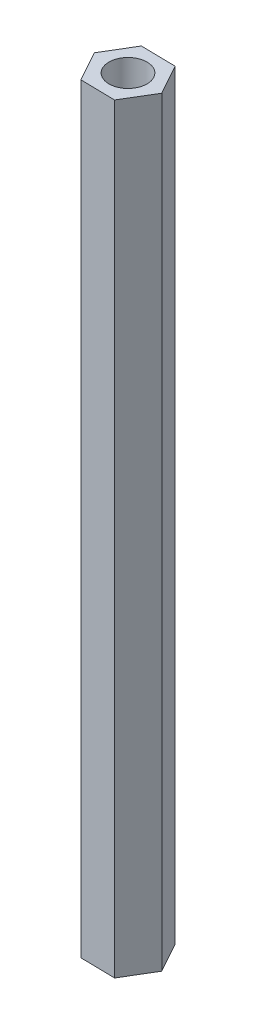
ISO-10303-21;
HEADER;
FILE_DESCRIPTION(('STEP AP214'),'2;1');
FILE_NAME('part.step','',(''),(''),'','','');
FILE_SCHEMA(('AUTOMOTIVE_DESIGN { 1 0 10303 214 1 1 1 1 }'));
ENDSEC;
DATA;
#1=APPLICATION_CONTEXT('core data for automotive mechanical design processes');
#2=APPLICATION_PROTOCOL_DEFINITION('international standard','automotive_design',2000,#1);
#3=PRODUCT_CONTEXT('',#1,'mechanical');
#4=PRODUCT('Part','Part','',(#3));
#5=PRODUCT_RELATED_PRODUCT_CATEGORY('part','',(#4));
#6=PRODUCT_DEFINITION_FORMATION('','',#4);
#7=PRODUCT_DEFINITION_CONTEXT('part definition',#1,'design');
#8=PRODUCT_DEFINITION('design','',#6,#7);
#9=PRODUCT_DEFINITION_SHAPE('','',#8);
#10=(LENGTH_UNIT() NAMED_UNIT(*) SI_UNIT(.MILLI.,.METRE.));
#11=(NAMED_UNIT(*) PLANE_ANGLE_UNIT() SI_UNIT($,.RADIAN.));
#12=(NAMED_UNIT(*) SI_UNIT($,.STERADIAN.) SOLID_ANGLE_UNIT());
#13=UNCERTAINTY_MEASURE_WITH_UNIT(LENGTH_MEASURE(1.E-05),#10,'distance_accuracy_value','');
#14=(GEOMETRIC_REPRESENTATION_CONTEXT(3) GLOBAL_UNCERTAINTY_ASSIGNED_CONTEXT((#13)) GLOBAL_UNIT_ASSIGNED_CONTEXT((#10,
#11,#12)) REPRESENTATION_CONTEXT('',''));
#15=CARTESIAN_POINT('',(0.,0.,0.));
#16=DIRECTION('',(0.,0.,1.));
#17=DIRECTION('',(1.,0.,0.));
#18=AXIS2_PLACEMENT_3D('',#15,#16,#17);
#19=CARTESIAN_POINT('',(0.,60.,0.));
#20=DIRECTION('',(0.,1.,0.));
#21=DIRECTION('',(0.,0.,1.));
#22=AXIS2_PLACEMENT_3D('',#19,#20,#21);
#23=PLANE('',#22);
#24=DIRECTION('',(-0.999831561867129,0.,-0.018353416421371));
#25=VECTOR('',#24,1.);
#26=CARTESIAN_POINT('',(1.39967512885266,60.,-2.3247027480959));
#27=LINE('',#26,#25);
#28=CARTESIAN_POINT('',(1.39967512885266,60.,-2.3247027480959));
#29=VERTEX_POINT('',#28);
#30=CARTESIAN_POINT('',(-1.31341407167221,60.,-2.37450559267961));
#31=VERTEX_POINT('',#30);
#32=EDGE_CURVE('E146',#29,#31,#27,.T.);
#33=ORIENTED_EDGE('',*,*,#32,.T.);
#34=DIRECTION('',(-0.515810305800707,0.,0.856702823871721));
#35=VECTOR('',#34,1.);
#36=CARTESIAN_POINT('',(-1.31341407167221,60.,-2.37450559267961));
#37=LINE('',#36,#35);
#38=CARTESIAN_POINT('',(-2.71308920052487,60.,-0.0498028445837118));
#39=VERTEX_POINT('',#38);
#40=EDGE_CURVE('E94',#31,#39,#37,.T.);
#41=ORIENTED_EDGE('',*,*,#40,.T.);
#42=DIRECTION('',(0.484021256066423,0.,0.875056240293093));
#43=VECTOR('',#42,1.);
#44=CARTESIAN_POINT('',(-2.71308920052487,60.,-0.0498028445837118));
#45=LINE('',#44,#43);
#46=CARTESIAN_POINT('',(-1.39967512885266,60.,2.3247027480959));
#47=VERTEX_POINT('',#46);
#48=EDGE_CURVE('E107',#39,#47,#45,.T.);
#49=ORIENTED_EDGE('',*,*,#48,.T.);
#50=DIRECTION('',(0.99983156186713,0.,0.0183534164213715));
#51=VECTOR('',#50,1.);
#52=CARTESIAN_POINT('',(-1.39967512885266,60.,2.3247027480959));
#53=LINE('',#52,#51);
#54=CARTESIAN_POINT('',(1.31341407167222,60.,2.37450559267961));
#55=VERTEX_POINT('',#54);
#56=EDGE_CURVE('E101',#47,#55,#53,.T.);
#57=ORIENTED_EDGE('',*,*,#56,.T.);
#58=DIRECTION('',(0.515810305800707,0.,-0.856702823871721));
#59=VECTOR('',#58,1.);
#60=CARTESIAN_POINT('',(1.31341407167222,60.,2.37450559267961));
#61=LINE('',#60,#59);
#62=CARTESIAN_POINT('',(2.71308920052488,60.,0.0498028445837108));
#63=VERTEX_POINT('',#62);
#64=EDGE_CURVE('E105',#55,#63,#61,.T.);
#65=ORIENTED_EDGE('',*,*,#64,.T.);
#66=DIRECTION('',(-0.484021256066423,0.,-0.875056240293092));
#67=VECTOR('',#66,1.);
#68=CARTESIAN_POINT('',(2.71308920052488,60.,0.0498028445837108));
#69=LINE('',#68,#67);
#70=EDGE_CURVE('E57',#63,#29,#69,.T.);
#71=ORIENTED_EDGE('',*,*,#70,.T.);
#72=EDGE_LOOP('',(#33,#41,#49,#57,#65,#71));
#73=FACE_BOUND('',#72,.T.);
#74=CARTESIAN_POINT('',(0.,60.,0.));
#75=DIRECTION('',(0.,1.,0.));
#76=DIRECTION('',(0.,0.,1.));
#77=AXIS2_PLACEMENT_3D('',#74,#75,#76);
#78=CIRCLE('',#77,1.5);
#79=CARTESIAN_POINT('',(0.,60.,1.5));
#80=VERTEX_POINT('',#79);
#81=EDGE_CURVE('E134',#80,#80,#78,.T.);
#82=ORIENTED_EDGE('',*,*,#81,.F.);
#83=EDGE_LOOP('',(#82));
#84=FACE_BOUND('',#83,.T.);
#85=ADVANCED_FACE('F39',(#73,#84),#23,.T.);
#86=CARTESIAN_POINT('',(0.,0.,0.));
#87=DIRECTION('',(0.,1.,0.));
#88=DIRECTION('',(0.,0.,1.));
#89=AXIS2_PLACEMENT_3D('',#86,#87,#88);
#90=PLANE('',#89);
#91=DIRECTION('',(-0.999831561867129,0.,-0.018353416421371));
#92=VECTOR('',#91,1.);
#93=CARTESIAN_POINT('',(1.39967512885266,0.,-2.3247027480959));
#94=LINE('',#93,#92);
#95=CARTESIAN_POINT('',(1.39967512885266,0.,-2.3247027480959));
#96=VERTEX_POINT('',#95);
#97=CARTESIAN_POINT('',(-1.31341407167221,0.,-2.37450559267961));
#98=VERTEX_POINT('',#97);
#99=EDGE_CURVE('E129',#96,#98,#94,.T.);
#100=ORIENTED_EDGE('',*,*,#99,.F.);
#101=DIRECTION('',(-0.484021256066423,0.,-0.875056240293092));
#102=VECTOR('',#101,1.);
#103=CARTESIAN_POINT('',(2.71308920052488,0.,0.0498028445837108));
#104=LINE('',#103,#102);
#105=CARTESIAN_POINT('',(2.71308920052488,0.,0.0498028445837108));
#106=VERTEX_POINT('',#105);
#107=EDGE_CURVE('E86',#106,#96,#104,.T.);
#108=ORIENTED_EDGE('',*,*,#107,.F.);
#109=DIRECTION('',(0.515810305800707,0.,-0.856702823871721));
#110=VECTOR('',#109,1.);
#111=CARTESIAN_POINT('',(1.31341407167222,0.,2.37450559267961));
#112=LINE('',#111,#110);
#113=CARTESIAN_POINT('',(1.31341407167222,0.,2.37450559267961));
#114=VERTEX_POINT('',#113);
#115=EDGE_CURVE('E80',#114,#106,#112,.T.);
#116=ORIENTED_EDGE('',*,*,#115,.F.);
#117=DIRECTION('',(0.99983156186713,0.,0.0183534164213715));
#118=VECTOR('',#117,1.);
#119=CARTESIAN_POINT('',(-1.39967512885266,0.,2.3247027480959));
#120=LINE('',#119,#118);
#121=CARTESIAN_POINT('',(-1.39967512885266,0.,2.3247027480959));
#122=VERTEX_POINT('',#121);
#123=EDGE_CURVE('E116',#122,#114,#120,.T.);
#124=ORIENTED_EDGE('',*,*,#123,.F.);
#125=DIRECTION('',(0.484021256066423,0.,0.875056240293093));
#126=VECTOR('',#125,1.);
#127=CARTESIAN_POINT('',(-2.71308920052487,0.,-0.0498028445837118));
#128=LINE('',#127,#126);
#129=CARTESIAN_POINT('',(-2.71308920052487,0.,-0.0498028445837118));
#130=VERTEX_POINT('',#129);
#131=EDGE_CURVE('E137',#130,#122,#128,.T.);
#132=ORIENTED_EDGE('',*,*,#131,.F.);
#133=DIRECTION('',(-0.515810305800707,0.,0.856702823871721));
#134=VECTOR('',#133,1.);
#135=CARTESIAN_POINT('',(-1.31341407167221,0.,-2.37450559267961));
#136=LINE('',#135,#134);
#137=EDGE_CURVE('E133',#98,#130,#136,.T.);
#138=ORIENTED_EDGE('',*,*,#137,.F.);
#139=EDGE_LOOP('',(#100,#108,#116,#124,#132,#138));
#140=FACE_BOUND('',#139,.T.);
#141=CARTESIAN_POINT('',(0.,0.,0.));
#142=DIRECTION('',(0.,1.,0.));
#143=DIRECTION('',(0.,0.,1.));
#144=AXIS2_PLACEMENT_3D('',#141,#142,#143);
#145=CIRCLE('',#144,1.5);
#146=CARTESIAN_POINT('',(0.,0.,1.5));
#147=VERTEX_POINT('',#146);
#148=EDGE_CURVE('E243',#147,#147,#145,.T.);
#149=ORIENTED_EDGE('',*,*,#148,.T.);
#150=EDGE_LOOP('',(#149));
#151=FACE_BOUND('',#150,.T.);
#152=ADVANCED_FACE('F159',(#140,#151),#90,.F.);
#153=CARTESIAN_POINT('',(1.39967512885266,60.,-2.3247027480959));
#154=DIRECTION('',(-0.018353416421371,0.,0.99983156186713));
#155=DIRECTION('',(0.99983156186713,0.,0.018353416421371));
#156=AXIS2_PLACEMENT_3D('',#153,#154,#155);
#157=PLANE('',#156);
#158=ORIENTED_EDGE('',*,*,#99,.T.);
#159=DIRECTION('',(0.,-1.,0.));
#160=VECTOR('',#159,1.);
#161=CARTESIAN_POINT('',(-1.31341407167221,60.,-2.37450559267961));
#162=LINE('',#161,#160);
#163=EDGE_CURVE('E11',#31,#98,#162,.T.);
#164=ORIENTED_EDGE('',*,*,#163,.F.);
#165=ORIENTED_EDGE('',*,*,#32,.F.);
#166=DIRECTION('',(0.,-1.,0.));
#167=VECTOR('',#166,1.);
#168=CARTESIAN_POINT('',(1.39967512885266,60.,-2.3247027480959));
#169=LINE('',#168,#167);
#170=EDGE_CURVE('E125',#29,#96,#169,.T.);
#171=ORIENTED_EDGE('',*,*,#170,.T.);
#172=EDGE_LOOP('',(#158,#164,#165,#171));
#173=FACE_BOUND('',#172,.T.);
#174=ADVANCED_FACE('F41',(#173),#157,.F.);
#175=CARTESIAN_POINT('',(-1.31341407167221,60.,-2.37450559267961));
#176=DIRECTION('',(0.856702823871721,0.,0.515810305800707));
#177=DIRECTION('',(0.515810305800707,0.,-0.856702823871721));
#178=AXIS2_PLACEMENT_3D('',#175,#176,#177);
#179=PLANE('',#178);
#180=ORIENTED_EDGE('',*,*,#137,.T.);
#181=DIRECTION('',(0.,-1.,0.));
#182=VECTOR('',#181,1.);
#183=CARTESIAN_POINT('',(-2.71308920052487,60.,-0.0498028445837118));
#184=LINE('',#183,#182);
#185=EDGE_CURVE('E49',#39,#130,#184,.T.);
#186=ORIENTED_EDGE('',*,*,#185,.F.);
#187=ORIENTED_EDGE('',*,*,#40,.F.);
#188=ORIENTED_EDGE('',*,*,#163,.T.);
#189=EDGE_LOOP('',(#180,#186,#187,#188));
#190=FACE_BOUND('',#189,.T.);
#191=ADVANCED_FACE('F184',(#190),#179,.F.);
#192=CARTESIAN_POINT('',(-2.71308920052487,60.,-0.0498028445837118));
#193=DIRECTION('',(0.875056240293093,0.,-0.484021256066423));
#194=DIRECTION('',(-0.484021256066423,0.,-0.875056240293093));
#195=AXIS2_PLACEMENT_3D('',#192,#193,#194);
#196=PLANE('',#195);
#197=ORIENTED_EDGE('',*,*,#131,.T.);
#198=DIRECTION('',(0.,-1.,0.));
#199=VECTOR('',#198,1.);
#200=CARTESIAN_POINT('',(-1.39967512885266,60.,2.3247027480959));
#201=LINE('',#200,#199);
#202=EDGE_CURVE('E118',#47,#122,#201,.T.);
#203=ORIENTED_EDGE('',*,*,#202,.F.);
#204=ORIENTED_EDGE('',*,*,#48,.F.);
#205=ORIENTED_EDGE('',*,*,#185,.T.);
#206=EDGE_LOOP('',(#197,#203,#204,#205));
#207=FACE_BOUND('',#206,.T.);
#208=ADVANCED_FACE('F156',(#207),#196,.F.);
#209=CARTESIAN_POINT('',(-1.39967512885266,60.,2.3247027480959));
#210=DIRECTION('',(0.0183534164213715,0.,-0.99983156186713));
#211=DIRECTION('',(-0.99983156186713,0.,-0.0183534164213715));
#212=AXIS2_PLACEMENT_3D('',#209,#210,#211);
#213=PLANE('',#212);
#214=ORIENTED_EDGE('',*,*,#123,.T.);
#215=DIRECTION('',(0.,-1.,0.));
#216=VECTOR('',#215,1.);
#217=CARTESIAN_POINT('',(1.31341407167222,60.,2.37450559267961));
#218=LINE('',#217,#216);
#219=EDGE_CURVE('E113',#55,#114,#218,.T.);
#220=ORIENTED_EDGE('',*,*,#219,.F.);
#221=ORIENTED_EDGE('',*,*,#56,.F.);
#222=ORIENTED_EDGE('',*,*,#202,.T.);
#223=EDGE_LOOP('',(#214,#220,#221,#222));
#224=FACE_BOUND('',#223,.T.);
#225=ADVANCED_FACE('F114',(#224),#213,.F.);
#226=CARTESIAN_POINT('',(1.31341407167222,60.,2.37450559267961));
#227=DIRECTION('',(-0.856702823871721,0.,-0.515810305800707));
#228=DIRECTION('',(-0.515810305800707,0.,0.856702823871721));
#229=AXIS2_PLACEMENT_3D('',#226,#227,#228);
#230=PLANE('',#229);
#231=ORIENTED_EDGE('',*,*,#115,.T.);
#232=DIRECTION('',(0.,-1.,0.));
#233=VECTOR('',#232,1.);
#234=CARTESIAN_POINT('',(2.71308920052488,60.,0.0498028445837108));
#235=LINE('',#234,#233);
#236=EDGE_CURVE('E119',#63,#106,#235,.T.);
#237=ORIENTED_EDGE('',*,*,#236,.F.);
#238=ORIENTED_EDGE('',*,*,#64,.F.);
#239=ORIENTED_EDGE('',*,*,#219,.T.);
#240=EDGE_LOOP('',(#231,#237,#238,#239));
#241=FACE_BOUND('',#240,.T.);
#242=ADVANCED_FACE('F121',(#241),#230,.F.);
#243=CARTESIAN_POINT('',(2.71308920052488,60.,0.0498028445837108));
#244=DIRECTION('',(-0.875056240293092,0.,0.484021256066423));
#245=DIRECTION('',(0.484021256066423,0.,0.875056240293092));
#246=AXIS2_PLACEMENT_3D('',#243,#244,#245);
#247=PLANE('',#246);
#248=ORIENTED_EDGE('',*,*,#107,.T.);
#249=ORIENTED_EDGE('',*,*,#170,.F.);
#250=ORIENTED_EDGE('',*,*,#70,.F.);
#251=ORIENTED_EDGE('',*,*,#236,.T.);
#252=EDGE_LOOP('',(#248,#249,#250,#251));
#253=FACE_BOUND('',#252,.T.);
#254=ADVANCED_FACE('F164',(#253),#247,.F.);
#255=CARTESIAN_POINT('',(0.,60.,0.));
#256=DIRECTION('',(0.,-1.,0.));
#257=DIRECTION('',(0.,0.,-1.));
#258=AXIS2_PLACEMENT_3D('',#255,#256,#257);
#259=CYLINDRICAL_SURFACE('',#258,1.5);
#260=ORIENTED_EDGE('',*,*,#81,.T.);
#261=EDGE_LOOP('',(#260));
#262=FACE_BOUND('',#261,.T.);
#263=ORIENTED_EDGE('',*,*,#148,.F.);
#264=EDGE_LOOP('',(#263));
#265=FACE_BOUND('',#264,.T.);
#266=ADVANCED_FACE('F166',(#262,#265),#259,.F.);
#267=CLOSED_SHELL('',(#85,#152,#174,#191,#208,#225,#242,#254,#266));
#268=MANIFOLD_SOLID_BREP('B2',#267);
#269=ADVANCED_BREP_SHAPE_REPRESENTATION('',(#18,#268),#14);
#270=SHAPE_DEFINITION_REPRESENTATION(#9,#269);
ENDSEC;
END-ISO-10303-21;
